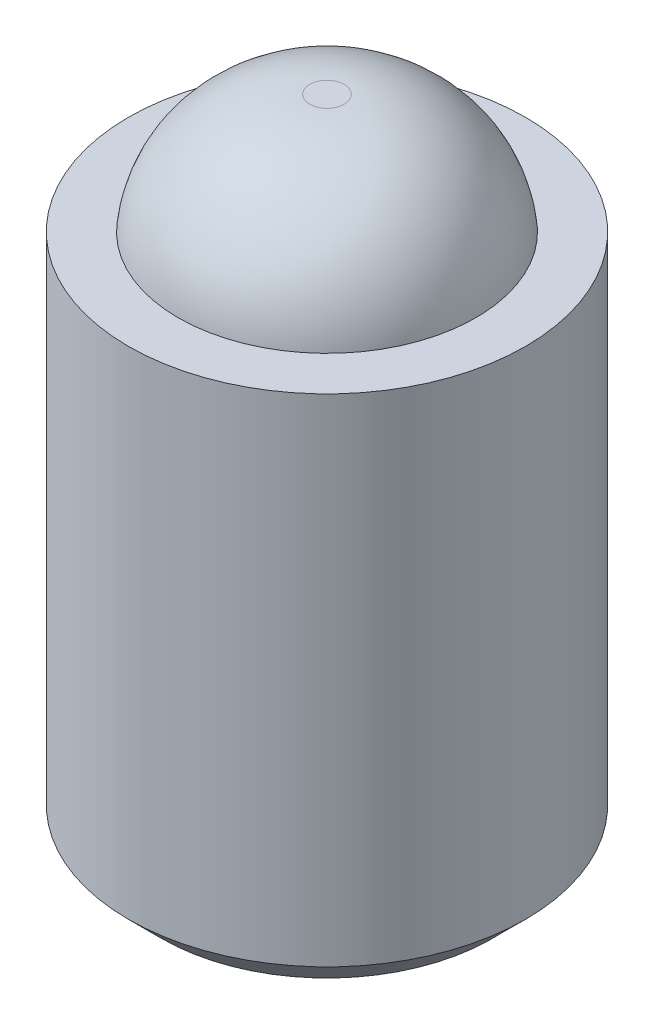
ISO-10303-21;
HEADER;
FILE_DESCRIPTION(('STEP AP214'),'2;1');
FILE_NAME('part.step','',(''),(''),'','','');
FILE_SCHEMA(('AUTOMOTIVE_DESIGN { 1 0 10303 214 1 1 1 1 }'));
ENDSEC;
DATA;
#1=APPLICATION_CONTEXT('core data for automotive mechanical design processes');
#2=APPLICATION_PROTOCOL_DEFINITION('international standard','automotive_design',2000,#1);
#3=PRODUCT_CONTEXT('',#1,'mechanical');
#4=PRODUCT('Part','Part','',(#3));
#5=PRODUCT_RELATED_PRODUCT_CATEGORY('part','',(#4));
#6=PRODUCT_DEFINITION_FORMATION('','',#4);
#7=PRODUCT_DEFINITION_CONTEXT('part definition',#1,'design');
#8=PRODUCT_DEFINITION('design','',#6,#7);
#9=PRODUCT_DEFINITION_SHAPE('','',#8);
#10=(LENGTH_UNIT() NAMED_UNIT(*) SI_UNIT(.MILLI.,.METRE.));
#11=(NAMED_UNIT(*) PLANE_ANGLE_UNIT() SI_UNIT($,.RADIAN.));
#12=(NAMED_UNIT(*) SI_UNIT($,.STERADIAN.) SOLID_ANGLE_UNIT());
#13=UNCERTAINTY_MEASURE_WITH_UNIT(LENGTH_MEASURE(1.E-05),#10,'distance_accuracy_value','');
#14=(GEOMETRIC_REPRESENTATION_CONTEXT(3) GLOBAL_UNCERTAINTY_ASSIGNED_CONTEXT((#13)) GLOBAL_UNIT_ASSIGNED_CONTEXT((#10,
#11,#12)) REPRESENTATION_CONTEXT('',''));
#15=CARTESIAN_POINT('',(0.,0.,0.));
#16=DIRECTION('',(0.,0.,1.));
#17=DIRECTION('',(1.,0.,0.));
#18=AXIS2_PLACEMENT_3D('',#15,#16,#17);
#19=CARTESIAN_POINT('',(0.,8.,0.));
#20=DIRECTION('',(0.,1.,0.));
#21=DIRECTION('',(0.,0.,1.));
#22=AXIS2_PLACEMENT_3D('',#19,#20,#21);
#23=PLANE('',#22);
#24=CARTESIAN_POINT('',(0.,8.,0.));
#25=DIRECTION('',(0.,1.,0.));
#26=DIRECTION('',(0.,0.,1.));
#27=AXIS2_PLACEMENT_3D('',#24,#25,#26);
#28=CIRCLE('',#27,3.);
#29=CARTESIAN_POINT('',(0.,8.,3.));
#30=VERTEX_POINT('',#29);
#31=EDGE_CURVE('E145',#30,#30,#28,.T.);
#32=ORIENTED_EDGE('',*,*,#31,.T.);
#33=EDGE_LOOP('',(#32));
#34=FACE_BOUND('',#33,.T.);
#35=CARTESIAN_POINT('',(0.,8.,0.));
#36=DIRECTION('',(0.,1.,0.));
#37=DIRECTION('',(0.,0.,1.));
#38=AXIS2_PLACEMENT_3D('',#35,#36,#37);
#39=CIRCLE('',#38,2.25);
#40=CARTESIAN_POINT('',(0.,8.,2.25));
#41=VERTEX_POINT('',#40);
#42=EDGE_CURVE('E137',#41,#41,#39,.T.);
#43=ORIENTED_EDGE('',*,*,#42,.F.);
#44=EDGE_LOOP('',(#43));
#45=FACE_BOUND('',#44,.T.);
#46=ADVANCED_FACE('F35',(#34,#45),#23,.T.);
#47=CARTESIAN_POINT('',(0.,8.,0.));
#48=DIRECTION('',(0.,-1.,0.));
#49=DIRECTION('',(0.,0.,-1.));
#50=AXIS2_PLACEMENT_3D('',#47,#48,#49);
#51=CYLINDRICAL_SURFACE('',#50,3.);
#52=CARTESIAN_POINT('',(0.,0.499999999999999,0.));
#53=DIRECTION('',(0.,1.,0.));
#54=DIRECTION('',(0.,0.,1.));
#55=AXIS2_PLACEMENT_3D('',#52,#53,#54);
#56=CIRCLE('',#55,3.);
#57=CARTESIAN_POINT('',(0.,0.499999999999999,3.));
#58=VERTEX_POINT('',#57);
#59=EDGE_CURVE('E43',#58,#58,#56,.T.);
#60=ORIENTED_EDGE('',*,*,#59,.T.);
#61=EDGE_LOOP('',(#60));
#62=FACE_BOUND('',#61,.T.);
#63=ORIENTED_EDGE('',*,*,#31,.F.);
#64=EDGE_LOOP('',(#63));
#65=FACE_BOUND('',#64,.T.);
#66=ADVANCED_FACE('F153',(#62,#65),#51,.T.);
#67=CARTESIAN_POINT('',(0.,0.,0.));
#68=DIRECTION('',(0.,1.,0.));
#69=DIRECTION('',(0.,0.,1.));
#70=AXIS2_PLACEMENT_3D('',#67,#68,#69);
#71=PLANE('',#70);
#72=DIRECTION('',(-0.866025403784438,0.,-0.500000000000001));
#73=VECTOR('',#72,1.);
#74=CARTESIAN_POINT('',(0.,0.,1.80876901197757));
#75=LINE('',#74,#73);
#76=CARTESIAN_POINT('',(0.,0.,1.80876901197757));
#77=VERTEX_POINT('',#76);
#78=CARTESIAN_POINT('',(-1.56643991395065,0.,0.90438450598878));
#79=VERTEX_POINT('',#78);
#80=EDGE_CURVE('E124',#77,#79,#75,.T.);
#81=ORIENTED_EDGE('',*,*,#80,.F.);
#82=DIRECTION('',(-0.866025403784441,0.,0.499999999999995));
#83=VECTOR('',#82,1.);
#84=CARTESIAN_POINT('',(1.56643991395064,0.,0.904384505988802));
#85=LINE('',#84,#83);
#86=CARTESIAN_POINT('',(1.56643991395064,0.,0.904384505988802));
#87=VERTEX_POINT('',#86);
#88=EDGE_CURVE('E50',#87,#77,#85,.T.);
#89=ORIENTED_EDGE('',*,*,#88,.F.);
#90=DIRECTION('',(0.,0.,1.));
#91=VECTOR('',#90,1.);
#92=CARTESIAN_POINT('',(1.56643991395066,0.,-0.904384505988769));
#93=LINE('',#92,#91);
#94=CARTESIAN_POINT('',(1.56643991395066,0.,-0.904384505988769));
#95=VERTEX_POINT('',#94);
#96=EDGE_CURVE('E133',#95,#87,#93,.T.);
#97=ORIENTED_EDGE('',*,*,#96,.F.);
#98=DIRECTION('',(0.866025403784435,0.,0.500000000000007));
#99=VECTOR('',#98,1.);
#100=CARTESIAN_POINT('',(0.,0.,-1.80876901197757));
#101=LINE('',#100,#99);
#102=CARTESIAN_POINT('',(0.,0.,-1.80876901197757));
#103=VERTEX_POINT('',#102);
#104=EDGE_CURVE('E131',#103,#95,#101,.T.);
#105=ORIENTED_EDGE('',*,*,#104,.F.);
#106=DIRECTION('',(0.866025403784442,0.,-0.499999999999995));
#107=VECTOR('',#106,1.);
#108=CARTESIAN_POINT('',(-1.56643991395065,0.,-0.904384505988791));
#109=LINE('',#108,#107);
#110=CARTESIAN_POINT('',(-1.56643991395065,0.,-0.904384505988791));
#111=VERTEX_POINT('',#110);
#112=EDGE_CURVE('E98',#111,#103,#109,.T.);
#113=ORIENTED_EDGE('',*,*,#112,.F.);
#114=DIRECTION('',(0.,0.,-1.));
#115=VECTOR('',#114,1.);
#116=CARTESIAN_POINT('',(-1.56643991395065,0.,0.90438450598878));
#117=LINE('',#116,#115);
#118=EDGE_CURVE('E127',#79,#111,#117,.T.);
#119=ORIENTED_EDGE('',*,*,#118,.F.);
#120=EDGE_LOOP('',(#81,#89,#97,#105,#113,#119));
#121=FACE_BOUND('',#120,.T.);
#122=CARTESIAN_POINT('',(0.,0.,0.));
#123=DIRECTION('',(0.,1.,0.));
#124=DIRECTION('',(0.,0.,1.));
#125=AXIS2_PLACEMENT_3D('',#122,#123,#124);
#126=CIRCLE('',#125,2.5);
#127=CARTESIAN_POINT('',(0.,0.,2.5));
#128=VERTEX_POINT('',#127);
#129=EDGE_CURVE('E11',#128,#128,#126,.F.);
#130=ORIENTED_EDGE('',*,*,#129,.T.);
#131=EDGE_LOOP('',(#130));
#132=FACE_BOUND('',#131,.T.);
#133=ADVANCED_FACE('F176',(#121,#132),#71,.F.);
#134=CARTESIAN_POINT('',(0.,9.8,0.));
#135=DIRECTION('',(0.,1.,0.));
#136=DIRECTION('',(0.,0.,1.));
#137=AXIS2_PLACEMENT_3D('',#134,#135,#136);
#138=PLANE('',#137);
#139=CARTESIAN_POINT('',(0.,9.8,0.));
#140=DIRECTION('',(0.,1.,0.));
#141=DIRECTION('',(0.,0.,1.));
#142=AXIS2_PLACEMENT_3D('',#139,#140,#141);
#143=CIRCLE('',#142,0.26002512578676);
#144=CARTESIAN_POINT('',(0.,9.8,0.26002512578676));
#145=VERTEX_POINT('',#144);
#146=EDGE_CURVE('E148',#145,#145,#143,.T.);
#147=ORIENTED_EDGE('',*,*,#146,.T.);
#148=EDGE_LOOP('',(#147));
#149=FACE_BOUND('',#148,.T.);
#150=ADVANCED_FACE('F166',(#149),#138,.T.);
#151=CARTESIAN_POINT('',(0.,7.8,0.));
#152=DIRECTION('',(0.,-1.,0.));
#153=DIRECTION('',(0.,0.,-1.));
#154=AXIS2_PLACEMENT_3D('',#151,#152,#153);
#155=DEGENERATE_TOROIDAL_SURFACE('',#154,0.26002512578676,2.,.T.);
#156=ORIENTED_EDGE('',*,*,#42,.T.);
#157=EDGE_LOOP('',(#156));
#158=FACE_BOUND('',#157,.T.);
#159=ORIENTED_EDGE('',*,*,#146,.F.);
#160=EDGE_LOOP('',(#159));
#161=FACE_BOUND('',#160,.T.);
#162=ADVANCED_FACE('F158',(#158,#161),#155,.T.);
#163=CARTESIAN_POINT('',(0.,0.499999999999999,0.));
#164=DIRECTION('',(0.,1.,0.));
#165=DIRECTION('',(0.,0.,1.));
#166=AXIS2_PLACEMENT_3D('',#163,#164,#165);
#167=CONICAL_SURFACE('',#166,3.,0.785398163397451);
#168=ORIENTED_EDGE('',*,*,#129,.F.);
#169=EDGE_LOOP('',(#168));
#170=FACE_BOUND('',#169,.T.);
#171=ORIENTED_EDGE('',*,*,#59,.F.);
#172=EDGE_LOOP('',(#171));
#173=FACE_BOUND('',#172,.T.);
#174=ADVANCED_FACE('F37',(#170,#173),#167,.T.);
#175=CARTESIAN_POINT('',(1.56643991395064,1.8,0.904384505988802));
#176=DIRECTION('',(0.499999999999995,0.,0.866025403784441));
#177=DIRECTION('',(0.866025403784442,0.,-0.499999999999995));
#178=AXIS2_PLACEMENT_3D('',#175,#176,#177);
#179=PLANE('',#178);
#180=ORIENTED_EDGE('',*,*,#88,.T.);
#181=DIRECTION('',(0.,-1.,0.));
#182=VECTOR('',#181,1.);
#183=CARTESIAN_POINT('',(0.,1.8,1.80876901197757));
#184=LINE('',#183,#182);
#185=CARTESIAN_POINT('',(0.,1.8,1.80876901197757));
#186=VERTEX_POINT('',#185);
#187=EDGE_CURVE('E80',#186,#77,#184,.T.);
#188=ORIENTED_EDGE('',*,*,#187,.F.);
#189=DIRECTION('',(-0.866025403784441,0.,0.499999999999995));
#190=VECTOR('',#189,1.);
#191=CARTESIAN_POINT('',(1.56643991395064,1.8,0.904384505988802));
#192=LINE('',#191,#190);
#193=CARTESIAN_POINT('',(1.56643991395064,1.8,0.904384505988802));
#194=VERTEX_POINT('',#193);
#195=EDGE_CURVE('E135',#194,#186,#192,.T.);
#196=ORIENTED_EDGE('',*,*,#195,.F.);
#197=DIRECTION('',(0.,-1.,0.));
#198=VECTOR('',#197,1.);
#199=CARTESIAN_POINT('',(1.56643991395064,1.8,0.904384505988802));
#200=LINE('',#199,#198);
#201=EDGE_CURVE('E58',#194,#87,#200,.T.);
#202=ORIENTED_EDGE('',*,*,#201,.T.);
#203=EDGE_LOOP('',(#180,#188,#196,#202));
#204=FACE_BOUND('',#203,.T.);
#205=ADVANCED_FACE('F157',(#204),#179,.F.);
#206=CARTESIAN_POINT('',(1.56643991395066,1.8,-0.904384505988769));
#207=DIRECTION('',(1.,0.,0.));
#208=DIRECTION('',(0.,0.,-1.));
#209=AXIS2_PLACEMENT_3D('',#206,#207,#208);
#210=PLANE('',#209);
#211=ORIENTED_EDGE('',*,*,#96,.T.);
#212=ORIENTED_EDGE('',*,*,#201,.F.);
#213=DIRECTION('',(0.,0.,1.));
#214=VECTOR('',#213,1.);
#215=CARTESIAN_POINT('',(1.56643991395066,1.8,-0.904384505988769));
#216=LINE('',#215,#214);
#217=CARTESIAN_POINT('',(1.56643991395066,1.8,-0.904384505988769));
#218=VERTEX_POINT('',#217);
#219=EDGE_CURVE('E110',#218,#194,#216,.T.);
#220=ORIENTED_EDGE('',*,*,#219,.F.);
#221=DIRECTION('',(0.,-1.,0.));
#222=VECTOR('',#221,1.);
#223=CARTESIAN_POINT('',(1.56643991395066,1.8,-0.904384505988769));
#224=LINE('',#223,#222);
#225=EDGE_CURVE('E102',#218,#95,#224,.T.);
#226=ORIENTED_EDGE('',*,*,#225,.T.);
#227=EDGE_LOOP('',(#211,#212,#220,#226));
#228=FACE_BOUND('',#227,.T.);
#229=ADVANCED_FACE('F164',(#228),#210,.F.);
#230=CARTESIAN_POINT('',(0.,1.8,-1.80876901197757));
#231=DIRECTION('',(0.500000000000007,0.,-0.866025403784435));
#232=DIRECTION('',(-0.866025403784435,0.,-0.500000000000007));
#233=AXIS2_PLACEMENT_3D('',#230,#231,#232);
#234=PLANE('',#233);
#235=ORIENTED_EDGE('',*,*,#104,.T.);
#236=ORIENTED_EDGE('',*,*,#225,.F.);
#237=DIRECTION('',(0.866025403784435,0.,0.500000000000007));
#238=VECTOR('',#237,1.);
#239=CARTESIAN_POINT('',(0.,1.8,-1.80876901197757));
#240=LINE('',#239,#238);
#241=CARTESIAN_POINT('',(0.,1.8,-1.80876901197757));
#242=VERTEX_POINT('',#241);
#243=EDGE_CURVE('E106',#242,#218,#240,.T.);
#244=ORIENTED_EDGE('',*,*,#243,.F.);
#245=DIRECTION('',(0.,-1.,0.));
#246=VECTOR('',#245,1.);
#247=CARTESIAN_POINT('',(0.,1.8,-1.80876901197757));
#248=LINE('',#247,#246);
#249=EDGE_CURVE('E91',#242,#103,#248,.T.);
#250=ORIENTED_EDGE('',*,*,#249,.T.);
#251=EDGE_LOOP('',(#235,#236,#244,#250));
#252=FACE_BOUND('',#251,.T.);
#253=ADVANCED_FACE('F107',(#252),#234,.F.);
#254=CARTESIAN_POINT('',(-1.56643991395065,1.8,-0.904384505988791));
#255=DIRECTION('',(-0.499999999999995,0.,-0.866025403784442));
#256=DIRECTION('',(-0.866025403784442,0.,0.499999999999995));
#257=AXIS2_PLACEMENT_3D('',#254,#255,#256);
#258=PLANE('',#257);
#259=ORIENTED_EDGE('',*,*,#112,.T.);
#260=ORIENTED_EDGE('',*,*,#249,.F.);
#261=DIRECTION('',(0.866025403784442,0.,-0.499999999999995));
#262=VECTOR('',#261,1.);
#263=CARTESIAN_POINT('',(-1.56643991395065,1.8,-0.904384505988791));
#264=LINE('',#263,#262);
#265=CARTESIAN_POINT('',(-1.56643991395065,1.8,-0.904384505988791));
#266=VERTEX_POINT('',#265);
#267=EDGE_CURVE('E95',#266,#242,#264,.T.);
#268=ORIENTED_EDGE('',*,*,#267,.F.);
#269=DIRECTION('',(0.,-1.,0.));
#270=VECTOR('',#269,1.);
#271=CARTESIAN_POINT('',(-1.56643991395065,1.8,-0.904384505988791));
#272=LINE('',#271,#270);
#273=EDGE_CURVE('E103',#266,#111,#272,.T.);
#274=ORIENTED_EDGE('',*,*,#273,.T.);
#275=EDGE_LOOP('',(#259,#260,#268,#274));
#276=FACE_BOUND('',#275,.T.);
#277=ADVANCED_FACE('F93',(#276),#258,.F.);
#278=CARTESIAN_POINT('',(-1.56643991395065,1.8,0.90438450598878));
#279=DIRECTION('',(-1.,0.,0.));
#280=DIRECTION('',(0.,0.,1.));
#281=AXIS2_PLACEMENT_3D('',#278,#279,#280);
#282=PLANE('',#281);
#283=ORIENTED_EDGE('',*,*,#118,.T.);
#284=ORIENTED_EDGE('',*,*,#273,.F.);
#285=DIRECTION('',(0.,0.,-1.));
#286=VECTOR('',#285,1.);
#287=CARTESIAN_POINT('',(-1.56643991395065,1.8,0.90438450598878));
#288=LINE('',#287,#286);
#289=CARTESIAN_POINT('',(-1.56643991395065,1.8,0.90438450598878));
#290=VERTEX_POINT('',#289);
#291=EDGE_CURVE('E116',#290,#266,#288,.T.);
#292=ORIENTED_EDGE('',*,*,#291,.F.);
#293=DIRECTION('',(0.,-1.,0.));
#294=VECTOR('',#293,1.);
#295=CARTESIAN_POINT('',(-1.56643991395065,1.8,0.90438450598878));
#296=LINE('',#295,#294);
#297=EDGE_CURVE('E140',#290,#79,#296,.T.);
#298=ORIENTED_EDGE('',*,*,#297,.T.);
#299=EDGE_LOOP('',(#283,#284,#292,#298));
#300=FACE_BOUND('',#299,.T.);
#301=ADVANCED_FACE('F205',(#300),#282,.F.);
#302=CARTESIAN_POINT('',(0.,1.8,1.80876901197757));
#303=DIRECTION('',(-0.500000000000001,0.,0.866025403784438));
#304=DIRECTION('',(0.866025403784438,0.,0.500000000000001));
#305=AXIS2_PLACEMENT_3D('',#302,#303,#304);
#306=PLANE('',#305);
#307=ORIENTED_EDGE('',*,*,#80,.T.);
#308=ORIENTED_EDGE('',*,*,#297,.F.);
#309=DIRECTION('',(-0.866025403784438,0.,-0.500000000000001));
#310=VECTOR('',#309,1.);
#311=CARTESIAN_POINT('',(0.,1.8,1.80876901197757));
#312=LINE('',#311,#310);
#313=EDGE_CURVE('E118',#186,#290,#312,.T.);
#314=ORIENTED_EDGE('',*,*,#313,.F.);
#315=ORIENTED_EDGE('',*,*,#187,.T.);
#316=EDGE_LOOP('',(#307,#308,#314,#315));
#317=FACE_BOUND('',#316,.T.);
#318=ADVANCED_FACE('F193',(#317),#306,.F.);
#319=CARTESIAN_POINT('',(0.,1.8,0.));
#320=DIRECTION('',(0.,-1.,0.));
#321=DIRECTION('',(0.,0.,-1.));
#322=AXIS2_PLACEMENT_3D('',#319,#320,#321);
#323=PLANE('',#322);
#324=ORIENTED_EDGE('',*,*,#195,.T.);
#325=ORIENTED_EDGE('',*,*,#313,.T.);
#326=ORIENTED_EDGE('',*,*,#291,.T.);
#327=ORIENTED_EDGE('',*,*,#267,.T.);
#328=ORIENTED_EDGE('',*,*,#243,.T.);
#329=ORIENTED_EDGE('',*,*,#219,.T.);
#330=EDGE_LOOP('',(#324,#325,#326,#327,#328,#329));
#331=FACE_BOUND('',#330,.T.);
#332=ADVANCED_FACE('F113',(#331),#323,.T.);
#333=CLOSED_SHELL('',(#46,#66,#133,#150,#162,#174,#205,#229,#253,#277,#301,#318,#332));
#334=MANIFOLD_SOLID_BREP('B2',#333);
#335=ADVANCED_BREP_SHAPE_REPRESENTATION('',(#18,#334),#14);
#336=SHAPE_DEFINITION_REPRESENTATION(#9,#335);
ENDSEC;
END-ISO-10303-21;
